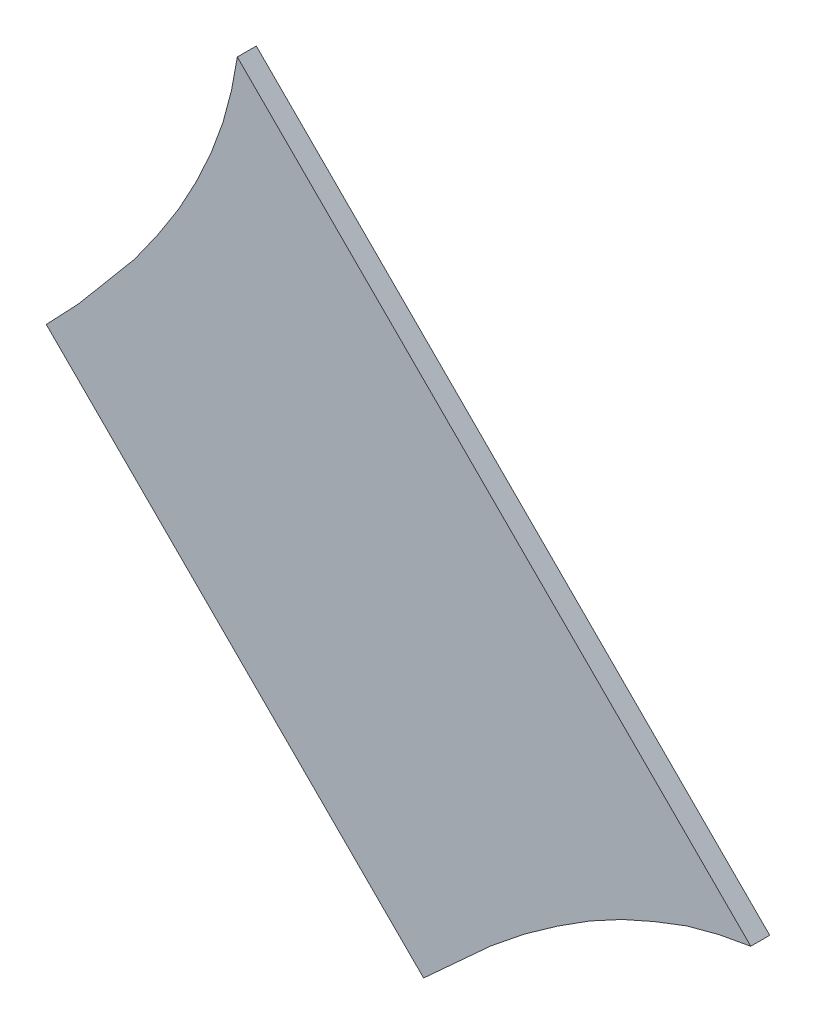
ISO-10303-21;
HEADER;
FILE_DESCRIPTION(('STEP AP214'),'2;1');
FILE_NAME('part.step','',(''),(''),'','','');
FILE_SCHEMA(('AUTOMOTIVE_DESIGN { 1 0 10303 214 1 1 1 1 }'));
ENDSEC;
DATA;
#1=APPLICATION_CONTEXT('core data for automotive mechanical design processes');
#2=APPLICATION_PROTOCOL_DEFINITION('international standard','automotive_design',2000,#1);
#3=PRODUCT_CONTEXT('',#1,'mechanical');
#4=PRODUCT('Part','Part','',(#3));
#5=PRODUCT_RELATED_PRODUCT_CATEGORY('part','',(#4));
#6=PRODUCT_DEFINITION_FORMATION('','',#4);
#7=PRODUCT_DEFINITION_CONTEXT('part definition',#1,'design');
#8=PRODUCT_DEFINITION('design','',#6,#7);
#9=PRODUCT_DEFINITION_SHAPE('','',#8);
#10=(LENGTH_UNIT() NAMED_UNIT(*) SI_UNIT(.MILLI.,.METRE.));
#11=(NAMED_UNIT(*) PLANE_ANGLE_UNIT() SI_UNIT($,.RADIAN.));
#12=(NAMED_UNIT(*) SI_UNIT($,.STERADIAN.) SOLID_ANGLE_UNIT());
#13=UNCERTAINTY_MEASURE_WITH_UNIT(LENGTH_MEASURE(1.E-05),#10,'distance_accuracy_value','');
#14=(GEOMETRIC_REPRESENTATION_CONTEXT(3) GLOBAL_UNCERTAINTY_ASSIGNED_CONTEXT((#13)) GLOBAL_UNIT_ASSIGNED_CONTEXT((#10,
#11,#12)) REPRESENTATION_CONTEXT('',''));
#15=CARTESIAN_POINT('',(0.,0.,0.));
#16=DIRECTION('',(0.,0.,1.));
#17=DIRECTION('',(1.,0.,0.));
#18=AXIS2_PLACEMENT_3D('',#15,#16,#17);
#19=CARTESIAN_POINT('',(77.5970001220703,103.069999694824,0.));
#20=DIRECTION('',(-0.674125127730621,0.73861716210915,0.));
#21=DIRECTION('',(0.73861716210915,0.674125127730621,0.));
#22=AXIS2_PLACEMENT_3D('',#19,#20,#21);
#23=PLANE('',#22);
#24=DIRECTION('',(0.73861716210915,0.674125127730621,0.));
#25=VECTOR('',#24,1.);
#26=CARTESIAN_POINT('',(77.5970001220703,103.069999694824,0.03556));
#27=LINE('',#26,#25);
#28=CARTESIAN_POINT('',(77.5970001220703,103.069999694824,0.03556));
#29=VERTEX_POINT('',#28);
#30=CARTESIAN_POINT('',(77.7229995727539,103.184997558594,0.03556));
#31=VERTEX_POINT('',#30);
#32=EDGE_CURVE('E11',#29,#31,#27,.T.);
#33=ORIENTED_EDGE('',*,*,#32,.F.);
#34=DIRECTION('',(0.,0.,1.));
#35=VECTOR('',#34,1.);
#36=CARTESIAN_POINT('',(77.5970001220703,103.069999694824,0.));
#37=LINE('',#36,#35);
#38=CARTESIAN_POINT('',(77.5970001220703,103.069999694824,0.));
#39=VERTEX_POINT('',#38);
#40=EDGE_CURVE('E24',#39,#29,#37,.T.);
#41=ORIENTED_EDGE('',*,*,#40,.F.);
#42=DIRECTION('',(0.73861716210915,0.674125127730621,0.));
#43=VECTOR('',#42,1.);
#44=CARTESIAN_POINT('',(77.5970001220703,103.069999694824,0.));
#45=LINE('',#44,#43);
#46=CARTESIAN_POINT('',(77.7229995727539,103.184997558594,0.));
#47=VERTEX_POINT('',#46);
#48=EDGE_CURVE('E172',#39,#47,#45,.T.);
#49=ORIENTED_EDGE('',*,*,#48,.T.);
#50=DIRECTION('',(0.,0.,1.));
#51=VECTOR('',#50,1.);
#52=CARTESIAN_POINT('',(77.7229995727539,103.184997558594,0.));
#53=LINE('',#52,#51);
#54=EDGE_CURVE('E37',#47,#31,#53,.T.);
#55=ORIENTED_EDGE('',*,*,#54,.T.);
#56=EDGE_LOOP('',(#33,#41,#49,#55));
#57=FACE_BOUND('',#56,.T.);
#58=ADVANCED_FACE('F17',(#57),#23,.F.);
#59=CARTESIAN_POINT('',(77.7229995727539,103.184997558594,0.));
#60=DIRECTION('',(-0.627750579044202,0.778414549266437,0.));
#61=DIRECTION('',(0.778414549266437,0.627750579044202,0.));
#62=AXIS2_PLACEMENT_3D('',#59,#60,#61);
#63=PLANE('',#62);
#64=DIRECTION('',(0.778414549266437,0.627750579044202,0.));
#65=VECTOR('',#64,1.);
#66=CARTESIAN_POINT('',(77.7229995727539,103.184997558594,0.03556));
#67=LINE('',#66,#65);
#68=CARTESIAN_POINT('',(77.7850036621094,103.235000610352,0.03556));
#69=VERTEX_POINT('',#68);
#70=EDGE_CURVE('E308',#31,#69,#67,.T.);
#71=ORIENTED_EDGE('',*,*,#70,.F.);
#72=ORIENTED_EDGE('',*,*,#54,.F.);
#73=DIRECTION('',(0.778414549266437,0.627750579044202,0.));
#74=VECTOR('',#73,1.);
#75=CARTESIAN_POINT('',(77.7229995727539,103.184997558594,0.));
#76=LINE('',#75,#74);
#77=CARTESIAN_POINT('',(77.7850036621094,103.235000610352,0.));
#78=VERTEX_POINT('',#77);
#79=EDGE_CURVE('E305',#47,#78,#76,.T.);
#80=ORIENTED_EDGE('',*,*,#79,.T.);
#81=DIRECTION('',(0.,0.,1.));
#82=VECTOR('',#81,1.);
#83=CARTESIAN_POINT('',(77.7850036621094,103.235000610352,0.));
#84=LINE('',#83,#82);
#85=EDGE_CURVE('E303',#78,#69,#84,.T.);
#86=ORIENTED_EDGE('',*,*,#85,.T.);
#87=EDGE_LOOP('',(#71,#72,#80,#86));
#88=FACE_BOUND('',#87,.T.);
#89=ADVANCED_FACE('F316',(#88),#63,.F.);
#90=CARTESIAN_POINT('',(77.7850036621094,103.235000610352,0.));
#91=DIRECTION('',(-0.578757770808919,0.815499505044786,0.));
#92=DIRECTION('',(0.815499505044786,0.578757770808919,0.));
#93=AXIS2_PLACEMENT_3D('',#90,#91,#92);
#94=PLANE('',#93);
#95=DIRECTION('',(0.815499505044786,0.578757770808919,0.));
#96=VECTOR('',#95,1.);
#97=CARTESIAN_POINT('',(77.7850036621094,103.235000610352,0.03556));
#98=LINE('',#97,#96);
#99=CARTESIAN_POINT('',(77.8470001220703,103.278999328613,0.03556));
#100=VERTEX_POINT('',#99);
#101=EDGE_CURVE('E300',#69,#100,#98,.T.);
#102=ORIENTED_EDGE('',*,*,#101,.F.);
#103=ORIENTED_EDGE('',*,*,#85,.F.);
#104=DIRECTION('',(0.815499505044786,0.578757770808919,0.));
#105=VECTOR('',#104,1.);
#106=CARTESIAN_POINT('',(77.7850036621094,103.235000610352,0.));
#107=LINE('',#106,#105);
#108=CARTESIAN_POINT('',(77.8470001220703,103.278999328613,0.));
#109=VERTEX_POINT('',#108);
#110=EDGE_CURVE('E297',#78,#109,#107,.T.);
#111=ORIENTED_EDGE('',*,*,#110,.T.);
#112=DIRECTION('',(0.,0.,1.));
#113=VECTOR('',#112,1.);
#114=CARTESIAN_POINT('',(77.8470001220703,103.278999328613,0.));
#115=LINE('',#114,#113);
#116=EDGE_CURVE('E295',#109,#100,#115,.T.);
#117=ORIENTED_EDGE('',*,*,#116,.T.);
#118=EDGE_LOOP('',(#102,#103,#111,#117));
#119=FACE_BOUND('',#118,.T.);
#120=ADVANCED_FACE('F322',(#119),#94,.F.);
#121=CARTESIAN_POINT('',(77.8470001220703,103.278999328613,0.));
#122=DIRECTION('',(-0.538694810440099,0.842500979942995,0.));
#123=DIRECTION('',(0.842500979942995,0.538694810440099,0.));
#124=AXIS2_PLACEMENT_3D('',#121,#122,#123);
#125=PLANE('',#124);
#126=DIRECTION('',(0.842500979942995,0.538694810440099,0.));
#127=VECTOR('',#126,1.);
#128=CARTESIAN_POINT('',(77.8470001220703,103.278999328613,0.03556));
#129=LINE('',#128,#127);
#130=CARTESIAN_POINT('',(77.9079971313477,103.318000793457,0.03556));
#131=VERTEX_POINT('',#130);
#132=EDGE_CURVE('E292',#100,#131,#129,.T.);
#133=ORIENTED_EDGE('',*,*,#132,.F.);
#134=ORIENTED_EDGE('',*,*,#116,.F.);
#135=DIRECTION('',(0.842500979942995,0.538694810440099,0.));
#136=VECTOR('',#135,1.);
#137=CARTESIAN_POINT('',(77.8470001220703,103.278999328613,0.));
#138=LINE('',#137,#136);
#139=CARTESIAN_POINT('',(77.9079971313477,103.318000793457,0.));
#140=VERTEX_POINT('',#139);
#141=EDGE_CURVE('E289',#109,#140,#138,.T.);
#142=ORIENTED_EDGE('',*,*,#141,.T.);
#143=DIRECTION('',(0.,0.,1.));
#144=VECTOR('',#143,1.);
#145=CARTESIAN_POINT('',(77.9079971313477,103.318000793457,0.));
#146=LINE('',#145,#144);
#147=EDGE_CURVE('E287',#140,#131,#146,.T.);
#148=ORIENTED_EDGE('',*,*,#147,.T.);
#149=EDGE_LOOP('',(#133,#134,#142,#148));
#150=FACE_BOUND('',#149,.T.);
#151=ADVANCED_FACE('F324',(#150),#125,.F.);
#152=CARTESIAN_POINT('',(77.9079971313477,103.318000793457,0.));
#153=DIRECTION('',(-0.475758597963286,0.879575895795245,0.));
#154=DIRECTION('',(0.879575895795245,0.475758597963286,0.));
#155=AXIS2_PLACEMENT_3D('',#152,#153,#154);
#156=PLANE('',#155);
#157=DIRECTION('',(0.879575895795245,0.475758597963286,0.));
#158=VECTOR('',#157,1.);
#159=CARTESIAN_POINT('',(77.9079971313477,103.318000793457,0.03556));
#160=LINE('',#159,#158);
#161=CARTESIAN_POINT('',(77.9690017700195,103.350997924805,0.03556));
#162=VERTEX_POINT('',#161);
#163=EDGE_CURVE('E284',#131,#162,#160,.T.);
#164=ORIENTED_EDGE('',*,*,#163,.F.);
#165=ORIENTED_EDGE('',*,*,#147,.F.);
#166=DIRECTION('',(0.879575895795245,0.475758597963286,0.));
#167=VECTOR('',#166,1.);
#168=CARTESIAN_POINT('',(77.9079971313477,103.318000793457,0.));
#169=LINE('',#168,#167);
#170=CARTESIAN_POINT('',(77.9690017700195,103.350997924805,0.));
#171=VERTEX_POINT('',#170);
#172=EDGE_CURVE('E281',#140,#171,#169,.T.);
#173=ORIENTED_EDGE('',*,*,#172,.T.);
#174=DIRECTION('',(0.,0.,1.));
#175=VECTOR('',#174,1.);
#176=CARTESIAN_POINT('',(77.9690017700195,103.350997924805,0.));
#177=LINE('',#176,#175);
#178=EDGE_CURVE('E279',#171,#162,#177,.T.);
#179=ORIENTED_EDGE('',*,*,#178,.T.);
#180=EDGE_LOOP('',(#164,#165,#173,#179));
#181=FACE_BOUND('',#180,.T.);
#182=ADVANCED_FACE('F329',(#181),#156,.F.);
#183=CARTESIAN_POINT('',(77.9690017700195,103.350997924805,0.));
#184=DIRECTION('',(-0.404769061439909,0.914418944959615,0.));
#185=DIRECTION('',(0.914418944959615,0.404769061439909,0.));
#186=AXIS2_PLACEMENT_3D('',#183,#184,#185);
#187=PLANE('',#186);
#188=DIRECTION('',(0.914418944959615,0.404769061439909,0.));
#189=VECTOR('',#188,1.);
#190=CARTESIAN_POINT('',(77.9690017700195,103.350997924805,0.03556));
#191=LINE('',#190,#189);
#192=CARTESIAN_POINT('',(78.0299987792969,103.377998352051,0.03556));
#193=VERTEX_POINT('',#192);
#194=EDGE_CURVE('E276',#162,#193,#191,.T.);
#195=ORIENTED_EDGE('',*,*,#194,.F.);
#196=ORIENTED_EDGE('',*,*,#178,.F.);
#197=DIRECTION('',(0.914418944959615,0.404769061439909,0.));
#198=VECTOR('',#197,1.);
#199=CARTESIAN_POINT('',(77.9690017700195,103.350997924805,0.));
#200=LINE('',#199,#198);
#201=CARTESIAN_POINT('',(78.0299987792969,103.377998352051,0.));
#202=VERTEX_POINT('',#201);
#203=EDGE_CURVE('E273',#171,#202,#200,.T.);
#204=ORIENTED_EDGE('',*,*,#203,.T.);
#205=DIRECTION('',(0.,0.,1.));
#206=VECTOR('',#205,1.);
#207=CARTESIAN_POINT('',(78.0299987792969,103.377998352051,0.));
#208=LINE('',#207,#206);
#209=EDGE_CURVE('E271',#202,#193,#208,.T.);
#210=ORIENTED_EDGE('',*,*,#209,.T.);
#211=EDGE_LOOP('',(#195,#196,#204,#210));
#212=FACE_BOUND('',#211,.T.);
#213=ADVANCED_FACE('F332',(#212),#187,.F.);
#214=CARTESIAN_POINT('',(78.0299987792969,103.377998352051,0.));
#215=DIRECTION('',(-0.357984321604058,0.933727597046206,0.));
#216=DIRECTION('',(0.933727597046206,0.357984321604058,0.));
#217=AXIS2_PLACEMENT_3D('',#214,#215,#216);
#218=PLANE('',#217);
#219=DIRECTION('',(0.933727597046206,0.357984321604058,0.));
#220=VECTOR('',#219,1.);
#221=CARTESIAN_POINT('',(78.0299987792969,103.377998352051,0.03556));
#222=LINE('',#221,#220);
#223=CARTESIAN_POINT('',(78.0899963378906,103.401000976562,0.03556));
#224=VERTEX_POINT('',#223);
#225=EDGE_CURVE('E268',#193,#224,#222,.T.);
#226=ORIENTED_EDGE('',*,*,#225,.F.);
#227=ORIENTED_EDGE('',*,*,#209,.F.);
#228=DIRECTION('',(0.933727597046206,0.357984321604058,0.));
#229=VECTOR('',#228,1.);
#230=CARTESIAN_POINT('',(78.0299987792969,103.377998352051,0.));
#231=LINE('',#230,#229);
#232=CARTESIAN_POINT('',(78.0899963378906,103.401000976562,0.));
#233=VERTEX_POINT('',#232);
#234=EDGE_CURVE('E265',#202,#233,#231,.T.);
#235=ORIENTED_EDGE('',*,*,#234,.T.);
#236=DIRECTION('',(0.,0.,1.));
#237=VECTOR('',#236,1.);
#238=CARTESIAN_POINT('',(78.0899963378906,103.401000976562,0.));
#239=LINE('',#238,#237);
#240=EDGE_CURVE('E263',#233,#224,#239,.T.);
#241=ORIENTED_EDGE('',*,*,#240,.T.);
#242=EDGE_LOOP('',(#226,#227,#235,#241));
#243=FACE_BOUND('',#242,.T.);
#244=ADVANCED_FACE('F337',(#243),#218,.F.);
#245=CARTESIAN_POINT('',(78.0899963378906,103.401000976562,0.));
#246=DIRECTION('',(-0.257624417848363,0.966245134180914,0.));
#247=DIRECTION('',(0.966245134180914,0.257624417848363,0.));
#248=AXIS2_PLACEMENT_3D('',#245,#246,#247);
#249=PLANE('',#248);
#250=DIRECTION('',(0.966245134180914,0.257624417848363,0.));
#251=VECTOR('',#250,1.);
#252=CARTESIAN_POINT('',(78.0899963378906,103.401000976562,0.03556));
#253=LINE('',#252,#251);
#254=CARTESIAN_POINT('',(78.1500015258789,103.416999816895,0.03556));
#255=VERTEX_POINT('',#254);
#256=EDGE_CURVE('E260',#224,#255,#253,.T.);
#257=ORIENTED_EDGE('',*,*,#256,.F.);
#258=ORIENTED_EDGE('',*,*,#240,.F.);
#259=DIRECTION('',(0.966245134180914,0.257624417848363,0.));
#260=VECTOR('',#259,1.);
#261=CARTESIAN_POINT('',(78.0899963378906,103.401000976562,0.));
#262=LINE('',#261,#260);
#263=CARTESIAN_POINT('',(78.1500015258789,103.416999816895,0.));
#264=VERTEX_POINT('',#263);
#265=EDGE_CURVE('E257',#233,#264,#262,.T.);
#266=ORIENTED_EDGE('',*,*,#265,.T.);
#267=DIRECTION('',(0.,0.,1.));
#268=VECTOR('',#267,1.);
#269=CARTESIAN_POINT('',(78.1500015258789,103.416999816895,0.));
#270=LINE('',#269,#268);
#271=EDGE_CURVE('E255',#264,#255,#270,.T.);
#272=ORIENTED_EDGE('',*,*,#271,.T.);
#273=EDGE_LOOP('',(#257,#258,#266,#272));
#274=FACE_BOUND('',#273,.T.);
#275=ADVANCED_FACE('F340',(#274),#249,.F.);
#276=CARTESIAN_POINT('',(78.1500015258789,103.416999816895,0.));
#277=DIRECTION('',(-0.180360137856034,0.983600640845944,0.));
#278=DIRECTION('',(0.983600640845944,0.180360137856034,0.));
#279=AXIS2_PLACEMENT_3D('',#276,#277,#278);
#280=PLANE('',#279);
#281=DIRECTION('',(0.983600640845944,0.180360137856034,0.));
#282=VECTOR('',#281,1.);
#283=CARTESIAN_POINT('',(78.1500015258789,103.416999816895,0.03556));
#284=LINE('',#283,#282);
#285=CARTESIAN_POINT('',(78.2099990844727,103.428001403809,0.03556));
#286=VERTEX_POINT('',#285);
#287=EDGE_CURVE('E252',#255,#286,#284,.T.);
#288=ORIENTED_EDGE('',*,*,#287,.F.);
#289=ORIENTED_EDGE('',*,*,#271,.F.);
#290=DIRECTION('',(0.983600640845944,0.180360137856034,0.));
#291=VECTOR('',#290,1.);
#292=CARTESIAN_POINT('',(78.1500015258789,103.416999816895,0.));
#293=LINE('',#292,#291);
#294=CARTESIAN_POINT('',(78.2099990844727,103.428001403809,0.));
#295=VERTEX_POINT('',#294);
#296=EDGE_CURVE('E249',#264,#295,#293,.T.);
#297=ORIENTED_EDGE('',*,*,#296,.T.);
#298=DIRECTION('',(0.,0.,1.));
#299=VECTOR('',#298,1.);
#300=CARTESIAN_POINT('',(78.2099990844727,103.428001403809,0.));
#301=LINE('',#300,#299);
#302=EDGE_CURVE('E247',#295,#286,#301,.T.);
#303=ORIENTED_EDGE('',*,*,#302,.T.);
#304=EDGE_LOOP('',(#288,#289,#297,#303));
#305=FACE_BOUND('',#304,.T.);
#306=ADVANCED_FACE('F345',(#305),#280,.F.);
#307=CARTESIAN_POINT('',(78.2099990844727,103.428001403809,0.));
#308=DIRECTION('',(-0.707106781186548,-0.707106781186548,0.));
#309=DIRECTION('',(-0.707106781186548,0.707106781186548,0.));
#310=AXIS2_PLACEMENT_3D('',#307,#308,#309);
#311=PLANE('',#310);
#312=DIRECTION('',(-0.707106781186548,0.707106781186548,0.));
#313=VECTOR('',#312,1.);
#314=CARTESIAN_POINT('',(78.2099990844727,103.428001403809,0.03556));
#315=LINE('',#314,#313);
#316=CARTESIAN_POINT('',(77.2480010986328,104.389999389648,0.03556));
#317=VERTEX_POINT('',#316);
#318=EDGE_CURVE('E244',#286,#317,#315,.T.);
#319=ORIENTED_EDGE('',*,*,#318,.F.);
#320=ORIENTED_EDGE('',*,*,#302,.F.);
#321=DIRECTION('',(-0.707106781186548,0.707106781186548,0.));
#322=VECTOR('',#321,1.);
#323=CARTESIAN_POINT('',(78.2099990844727,103.428001403809,0.));
#324=LINE('',#323,#322);
#325=CARTESIAN_POINT('',(77.2480010986328,104.389999389648,0.));
#326=VERTEX_POINT('',#325);
#327=EDGE_CURVE('E241',#295,#326,#324,.T.);
#328=ORIENTED_EDGE('',*,*,#327,.T.);
#329=DIRECTION('',(0.,0.,1.));
#330=VECTOR('',#329,1.);
#331=CARTESIAN_POINT('',(77.2480010986328,104.389999389648,0.));
#332=LINE('',#331,#330);
#333=EDGE_CURVE('E239',#326,#317,#332,.T.);
#334=ORIENTED_EDGE('',*,*,#333,.T.);
#335=EDGE_LOOP('',(#319,#320,#328,#334));
#336=FACE_BOUND('',#335,.T.);
#337=ADVANCED_FACE('F348',(#336),#311,.F.);
#338=CARTESIAN_POINT('',(77.2480010986328,104.389999389648,0.));
#339=DIRECTION('',(0.983600640845944,-0.180360137856034,0.));
#340=DIRECTION('',(-0.180360137856034,-0.983600640845944,0.));
#341=AXIS2_PLACEMENT_3D('',#338,#339,#340);
#342=PLANE('',#341);
#343=DIRECTION('',(-0.180360137856034,-0.983600640845944,0.));
#344=VECTOR('',#343,1.);
#345=CARTESIAN_POINT('',(77.2480010986328,104.389999389648,0.03556));
#346=LINE('',#345,#344);
#347=CARTESIAN_POINT('',(77.2369995117188,104.330001831055,0.03556));
#348=VERTEX_POINT('',#347);
#349=EDGE_CURVE('E236',#317,#348,#346,.T.);
#350=ORIENTED_EDGE('',*,*,#349,.F.);
#351=ORIENTED_EDGE('',*,*,#333,.F.);
#352=DIRECTION('',(-0.180360137856034,-0.983600640845944,0.));
#353=VECTOR('',#352,1.);
#354=CARTESIAN_POINT('',(77.2480010986328,104.389999389648,0.));
#355=LINE('',#354,#353);
#356=CARTESIAN_POINT('',(77.2369995117188,104.330001831055,0.));
#357=VERTEX_POINT('',#356);
#358=EDGE_CURVE('E233',#326,#357,#355,.T.);
#359=ORIENTED_EDGE('',*,*,#358,.T.);
#360=DIRECTION('',(0.,0.,1.));
#361=VECTOR('',#360,1.);
#362=CARTESIAN_POINT('',(77.2369995117188,104.330001831055,0.));
#363=LINE('',#362,#361);
#364=EDGE_CURVE('E231',#357,#348,#363,.T.);
#365=ORIENTED_EDGE('',*,*,#364,.T.);
#366=EDGE_LOOP('',(#350,#351,#359,#365));
#367=FACE_BOUND('',#366,.T.);
#368=ADVANCED_FACE('F353',(#367),#342,.F.);
#369=CARTESIAN_POINT('',(77.2369995117188,104.330001831055,0.));
#370=DIRECTION('',(0.966245134180914,-0.257624417848363,0.));
#371=DIRECTION('',(-0.257624417848363,-0.966245134180914,0.));
#372=AXIS2_PLACEMENT_3D('',#369,#370,#371);
#373=PLANE('',#372);
#374=DIRECTION('',(-0.257624417848363,-0.966245134180914,0.));
#375=VECTOR('',#374,1.);
#376=CARTESIAN_POINT('',(77.2369995117188,104.330001831055,0.03556));
#377=LINE('',#376,#375);
#378=CARTESIAN_POINT('',(77.2210006713867,104.269996643066,0.03556));
#379=VERTEX_POINT('',#378);
#380=EDGE_CURVE('E228',#348,#379,#377,.T.);
#381=ORIENTED_EDGE('',*,*,#380,.F.);
#382=ORIENTED_EDGE('',*,*,#364,.F.);
#383=DIRECTION('',(-0.257624417848363,-0.966245134180914,0.));
#384=VECTOR('',#383,1.);
#385=CARTESIAN_POINT('',(77.2369995117188,104.330001831055,0.));
#386=LINE('',#385,#384);
#387=CARTESIAN_POINT('',(77.2210006713867,104.269996643066,0.));
#388=VERTEX_POINT('',#387);
#389=EDGE_CURVE('E225',#357,#388,#386,.T.);
#390=ORIENTED_EDGE('',*,*,#389,.T.);
#391=DIRECTION('',(0.,0.,1.));
#392=VECTOR('',#391,1.);
#393=CARTESIAN_POINT('',(77.2210006713867,104.269996643066,0.));
#394=LINE('',#393,#392);
#395=EDGE_CURVE('E223',#388,#379,#394,.T.);
#396=ORIENTED_EDGE('',*,*,#395,.T.);
#397=EDGE_LOOP('',(#381,#382,#390,#396));
#398=FACE_BOUND('',#397,.T.);
#399=ADVANCED_FACE('F356',(#398),#373,.F.);
#400=CARTESIAN_POINT('',(77.2210006713867,104.269996643066,0.));
#401=DIRECTION('',(0.938855734355202,-0.344310775417142,0.));
#402=DIRECTION('',(-0.344310775417142,-0.938855734355202,0.));
#403=AXIS2_PLACEMENT_3D('',#400,#401,#402);
#404=PLANE('',#403);
#405=DIRECTION('',(-0.344310775417142,-0.938855734355202,0.));
#406=VECTOR('',#405,1.);
#407=CARTESIAN_POINT('',(77.2210006713867,104.269996643066,0.03556));
#408=LINE('',#407,#406);
#409=CARTESIAN_POINT('',(77.1989974975586,104.209999084473,0.03556));
#410=VERTEX_POINT('',#409);
#411=EDGE_CURVE('E220',#379,#410,#408,.T.);
#412=ORIENTED_EDGE('',*,*,#411,.F.);
#413=ORIENTED_EDGE('',*,*,#395,.F.);
#414=DIRECTION('',(-0.344310775417142,-0.938855734355202,0.));
#415=VECTOR('',#414,1.);
#416=CARTESIAN_POINT('',(77.2210006713867,104.269996643066,0.));
#417=LINE('',#416,#415);
#418=CARTESIAN_POINT('',(77.1989974975586,104.209999084473,0.));
#419=VERTEX_POINT('',#418);
#420=EDGE_CURVE('E217',#388,#419,#417,.T.);
#421=ORIENTED_EDGE('',*,*,#420,.T.);
#422=DIRECTION('',(0.,0.,1.));
#423=VECTOR('',#422,1.);
#424=CARTESIAN_POINT('',(77.1989974975586,104.209999084473,0.));
#425=LINE('',#424,#423);
#426=EDGE_CURVE('E215',#419,#410,#425,.T.);
#427=ORIENTED_EDGE('',*,*,#426,.T.);
#428=EDGE_LOOP('',(#412,#413,#421,#427));
#429=FACE_BOUND('',#428,.T.);
#430=ADVANCED_FACE('F361',(#429),#404,.F.);
#431=CARTESIAN_POINT('',(77.1989974975586,104.209999084473,0.));
#432=DIRECTION('',(0.908822480400275,-0.417183052291308,0.));
#433=DIRECTION('',(-0.417183052291308,-0.908822480400275,0.));
#434=AXIS2_PLACEMENT_3D('',#431,#432,#433);
#435=PLANE('',#434);
#436=DIRECTION('',(-0.417183052291308,-0.908822480400275,0.));
#437=VECTOR('',#436,1.);
#438=CARTESIAN_POINT('',(77.1989974975586,104.209999084473,0.03556));
#439=LINE('',#438,#437);
#440=CARTESIAN_POINT('',(77.1709976196289,104.149002075195,0.03556));
#441=VERTEX_POINT('',#440);
#442=EDGE_CURVE('E212',#410,#441,#439,.T.);
#443=ORIENTED_EDGE('',*,*,#442,.F.);
#444=ORIENTED_EDGE('',*,*,#426,.F.);
#445=DIRECTION('',(-0.417183052291308,-0.908822480400275,0.));
#446=VECTOR('',#445,1.);
#447=CARTESIAN_POINT('',(77.1989974975586,104.209999084473,0.));
#448=LINE('',#447,#446);
#449=CARTESIAN_POINT('',(77.1709976196289,104.149002075195,0.));
#450=VERTEX_POINT('',#449);
#451=EDGE_CURVE('E209',#419,#450,#448,.T.);
#452=ORIENTED_EDGE('',*,*,#451,.T.);
#453=DIRECTION('',(0.,0.,1.));
#454=VECTOR('',#453,1.);
#455=CARTESIAN_POINT('',(77.1709976196289,104.149002075195,0.));
#456=LINE('',#455,#454);
#457=EDGE_CURVE('E207',#450,#441,#456,.T.);
#458=ORIENTED_EDGE('',*,*,#457,.T.);
#459=EDGE_LOOP('',(#443,#444,#452,#458));
#460=FACE_BOUND('',#459,.T.);
#461=ADVANCED_FACE('F364',(#460),#435,.F.);
#462=CARTESIAN_POINT('',(77.1709976196289,104.149002075195,0.));
#463=DIRECTION('',(0.879575895795245,-0.475758597963286,0.));
#464=DIRECTION('',(-0.475758597963286,-0.879575895795245,0.));
#465=AXIS2_PLACEMENT_3D('',#462,#463,#464);
#466=PLANE('',#465);
#467=DIRECTION('',(-0.475758597963286,-0.879575895795245,0.));
#468=VECTOR('',#467,1.);
#469=CARTESIAN_POINT('',(77.1709976196289,104.149002075195,0.03556));
#470=LINE('',#469,#468);
#471=CARTESIAN_POINT('',(77.1380004882812,104.087997436523,0.03556));
#472=VERTEX_POINT('',#471);
#473=EDGE_CURVE('E204',#441,#472,#470,.T.);
#474=ORIENTED_EDGE('',*,*,#473,.F.);
#475=ORIENTED_EDGE('',*,*,#457,.F.);
#476=DIRECTION('',(-0.475758597963286,-0.879575895795245,0.));
#477=VECTOR('',#476,1.);
#478=CARTESIAN_POINT('',(77.1709976196289,104.149002075195,0.));
#479=LINE('',#478,#477);
#480=CARTESIAN_POINT('',(77.1380004882812,104.087997436523,0.));
#481=VERTEX_POINT('',#480);
#482=EDGE_CURVE('E201',#450,#481,#479,.T.);
#483=ORIENTED_EDGE('',*,*,#482,.T.);
#484=DIRECTION('',(0.,0.,1.));
#485=VECTOR('',#484,1.);
#486=CARTESIAN_POINT('',(77.1380004882812,104.087997436523,0.));
#487=LINE('',#486,#485);
#488=EDGE_CURVE('E199',#481,#472,#487,.T.);
#489=ORIENTED_EDGE('',*,*,#488,.T.);
#490=EDGE_LOOP('',(#474,#475,#483,#489));
#491=FACE_BOUND('',#490,.T.);
#492=ADVANCED_FACE('F369',(#491),#466,.F.);
#493=CARTESIAN_POINT('',(77.1380004882812,104.087997436523,0.));
#494=DIRECTION('',(0.842500979942995,-0.538694810440099,0.));
#495=DIRECTION('',(-0.538694810440099,-0.842500979942995,0.));
#496=AXIS2_PLACEMENT_3D('',#493,#494,#495);
#497=PLANE('',#496);
#498=DIRECTION('',(-0.538694810440099,-0.842500979942995,0.));
#499=VECTOR('',#498,1.);
#500=CARTESIAN_POINT('',(77.1380004882812,104.087997436523,0.03556));
#501=LINE('',#500,#499);
#502=CARTESIAN_POINT('',(77.0989990234375,104.027000427246,0.03556));
#503=VERTEX_POINT('',#502);
#504=EDGE_CURVE('E196',#472,#503,#501,.T.);
#505=ORIENTED_EDGE('',*,*,#504,.F.);
#506=ORIENTED_EDGE('',*,*,#488,.F.);
#507=DIRECTION('',(-0.538694810440099,-0.842500979942995,0.));
#508=VECTOR('',#507,1.);
#509=CARTESIAN_POINT('',(77.1380004882812,104.087997436523,0.));
#510=LINE('',#509,#508);
#511=CARTESIAN_POINT('',(77.0989990234375,104.027000427246,0.));
#512=VERTEX_POINT('',#511);
#513=EDGE_CURVE('E193',#481,#512,#510,.T.);
#514=ORIENTED_EDGE('',*,*,#513,.T.);
#515=DIRECTION('',(0.,0.,1.));
#516=VECTOR('',#515,1.);
#517=CARTESIAN_POINT('',(77.0989990234375,104.027000427246,0.));
#518=LINE('',#517,#516);
#519=EDGE_CURVE('E191',#512,#503,#518,.T.);
#520=ORIENTED_EDGE('',*,*,#519,.T.);
#521=EDGE_LOOP('',(#505,#506,#514,#520));
#522=FACE_BOUND('',#521,.T.);
#523=ADVANCED_FACE('F372',(#522),#497,.F.);
#524=CARTESIAN_POINT('',(77.0989990234375,104.027000427246,0.));
#525=DIRECTION('',(0.815533116494249,-0.578710407631639,0.));
#526=DIRECTION('',(-0.578710407631639,-0.815533116494249,0.));
#527=AXIS2_PLACEMENT_3D('',#524,#525,#526);
#528=PLANE('',#527);
#529=DIRECTION('',(-0.578710407631639,-0.815533116494249,0.));
#530=VECTOR('',#529,1.);
#531=CARTESIAN_POINT('',(77.0989990234375,104.027000427246,0.03556));
#532=LINE('',#531,#530);
#533=CARTESIAN_POINT('',(77.0550003051758,103.964996337891,0.03556));
#534=VERTEX_POINT('',#533);
#535=EDGE_CURVE('E188',#503,#534,#532,.T.);
#536=ORIENTED_EDGE('',*,*,#535,.F.);
#537=ORIENTED_EDGE('',*,*,#519,.F.);
#538=DIRECTION('',(-0.578710407631639,-0.815533116494249,0.));
#539=VECTOR('',#538,1.);
#540=CARTESIAN_POINT('',(77.0989990234375,104.027000427246,0.));
#541=LINE('',#540,#539);
#542=CARTESIAN_POINT('',(77.0550003051758,103.964996337891,0.));
#543=VERTEX_POINT('',#542);
#544=EDGE_CURVE('E185',#512,#543,#541,.T.);
#545=ORIENTED_EDGE('',*,*,#544,.T.);
#546=DIRECTION('',(0.,0.,1.));
#547=VECTOR('',#546,1.);
#548=CARTESIAN_POINT('',(77.0550003051758,103.964996337891,0.));
#549=LINE('',#548,#547);
#550=EDGE_CURVE('E183',#543,#534,#549,.T.);
#551=ORIENTED_EDGE('',*,*,#550,.T.);
#552=EDGE_LOOP('',(#536,#537,#545,#551));
#553=FACE_BOUND('',#552,.T.);
#554=ADVANCED_FACE('F377',(#553),#528,.F.);
#555=CARTESIAN_POINT('',(77.0550003051758,103.964996337891,0.));
#556=DIRECTION('',(0.765694737468783,-0.643204142564872,0.));
#557=DIRECTION('',(-0.643204142564872,-0.765694737468783,0.));
#558=AXIS2_PLACEMENT_3D('',#555,#556,#557);
#559=PLANE('',#558);
#560=DIRECTION('',(-0.643204142564872,-0.765694737468783,0.));
#561=VECTOR('',#560,1.);
#562=CARTESIAN_POINT('',(77.0550003051758,103.964996337891,0.03556));
#563=LINE('',#562,#561);
#564=CARTESIAN_POINT('',(76.9499969482422,103.839996337891,0.03556));
#565=VERTEX_POINT('',#564);
#566=EDGE_CURVE('E180',#534,#565,#563,.T.);
#567=ORIENTED_EDGE('',*,*,#566,.F.);
#568=ORIENTED_EDGE('',*,*,#550,.F.);
#569=DIRECTION('',(-0.643204142564872,-0.765694737468783,0.));
#570=VECTOR('',#569,1.);
#571=CARTESIAN_POINT('',(77.0550003051758,103.964996337891,0.));
#572=LINE('',#571,#570);
#573=CARTESIAN_POINT('',(76.9499969482422,103.839996337891,0.));
#574=VERTEX_POINT('',#573);
#575=EDGE_CURVE('E178',#543,#574,#572,.T.);
#576=ORIENTED_EDGE('',*,*,#575,.T.);
#577=DIRECTION('',(0.,0.,1.));
#578=VECTOR('',#577,1.);
#579=CARTESIAN_POINT('',(76.9499969482422,103.839996337891,0.));
#580=LINE('',#579,#578);
#581=EDGE_CURVE('E163',#574,#565,#580,.T.);
#582=ORIENTED_EDGE('',*,*,#581,.T.);
#583=EDGE_LOOP('',(#567,#568,#576,#582));
#584=FACE_BOUND('',#583,.T.);
#585=ADVANCED_FACE('F379',(#584),#559,.F.);
#586=CARTESIAN_POINT('',(76.9499969482422,103.839996337891,0.));
#587=DIRECTION('',(0.724129588639311,-0.68966393182264,0.));
#588=DIRECTION('',(-0.68966393182264,-0.724129588639311,0.));
#589=AXIS2_PLACEMENT_3D('',#586,#587,#588);
#590=PLANE('',#589);
#591=DIRECTION('',(-0.68966393182264,-0.724129588639311,0.));
#592=VECTOR('',#591,1.);
#593=CARTESIAN_POINT('',(76.9499969482422,103.839996337891,0.03556));
#594=LINE('',#593,#592);
#595=CARTESIAN_POINT('',(76.8899993896484,103.777000427246,0.03556));
#596=VERTEX_POINT('',#595);
#597=EDGE_CURVE('E167',#565,#596,#594,.T.);
#598=ORIENTED_EDGE('',*,*,#597,.F.);
#599=ORIENTED_EDGE('',*,*,#581,.F.);
#600=DIRECTION('',(-0.68966393182264,-0.724129588639311,0.));
#601=VECTOR('',#600,1.);
#602=CARTESIAN_POINT('',(76.9499969482422,103.839996337891,0.));
#603=LINE('',#602,#601);
#604=CARTESIAN_POINT('',(76.8899993896484,103.777000427246,0.));
#605=VERTEX_POINT('',#604);
#606=EDGE_CURVE('E159',#574,#605,#603,.T.);
#607=ORIENTED_EDGE('',*,*,#606,.T.);
#608=DIRECTION('',(0.,0.,1.));
#609=VECTOR('',#608,1.);
#610=CARTESIAN_POINT('',(76.8899993896484,103.777000427246,0.));
#611=LINE('',#610,#609);
#612=EDGE_CURVE('E149',#605,#596,#611,.T.);
#613=ORIENTED_EDGE('',*,*,#612,.T.);
#614=EDGE_LOOP('',(#598,#599,#607,#613));
#615=FACE_BOUND('',#614,.T.);
#616=ADVANCED_FACE('F162',(#615),#590,.F.);
#617=CARTESIAN_POINT('',(76.8899993896484,103.777000427246,0.));
#618=DIRECTION('',(0.707106781186548,0.707106781186548,0.));
#619=DIRECTION('',(0.707106781186548,-0.707106781186548,0.));
#620=AXIS2_PLACEMENT_3D('',#617,#618,#619);
#621=PLANE('',#620);
#622=DIRECTION('',(0.707106781186548,-0.707106781186548,0.));
#623=VECTOR('',#622,1.);
#624=CARTESIAN_POINT('',(76.8899993896484,103.777000427246,0.03556));
#625=LINE('',#624,#623);
#626=EDGE_CURVE('E155',#596,#29,#625,.T.);
#627=ORIENTED_EDGE('',*,*,#626,.F.);
#628=ORIENTED_EDGE('',*,*,#612,.F.);
#629=DIRECTION('',(0.707106781186548,-0.707106781186548,0.));
#630=VECTOR('',#629,1.);
#631=CARTESIAN_POINT('',(76.8899993896484,103.777000427246,0.));
#632=LINE('',#631,#630);
#633=EDGE_CURVE('E153',#605,#39,#632,.T.);
#634=ORIENTED_EDGE('',*,*,#633,.T.);
#635=ORIENTED_EDGE('',*,*,#40,.T.);
#636=EDGE_LOOP('',(#627,#628,#634,#635));
#637=FACE_BOUND('',#636,.T.);
#638=ADVANCED_FACE('F151',(#637),#621,.F.);
#639=CARTESIAN_POINT('',(77.5970001220703,103.069999694824,0.));
#640=DIRECTION('',(0.,0.,1.));
#641=DIRECTION('',(1.,0.,0.));
#642=AXIS2_PLACEMENT_3D('',#639,#640,#641);
#643=PLANE('',#642);
#644=ORIENTED_EDGE('',*,*,#633,.F.);
#645=ORIENTED_EDGE('',*,*,#606,.F.);
#646=ORIENTED_EDGE('',*,*,#575,.F.);
#647=ORIENTED_EDGE('',*,*,#544,.F.);
#648=ORIENTED_EDGE('',*,*,#513,.F.);
#649=ORIENTED_EDGE('',*,*,#482,.F.);
#650=ORIENTED_EDGE('',*,*,#451,.F.);
#651=ORIENTED_EDGE('',*,*,#420,.F.);
#652=ORIENTED_EDGE('',*,*,#389,.F.);
#653=ORIENTED_EDGE('',*,*,#358,.F.);
#654=ORIENTED_EDGE('',*,*,#327,.F.);
#655=ORIENTED_EDGE('',*,*,#296,.F.);
#656=ORIENTED_EDGE('',*,*,#265,.F.);
#657=ORIENTED_EDGE('',*,*,#234,.F.);
#658=ORIENTED_EDGE('',*,*,#203,.F.);
#659=ORIENTED_EDGE('',*,*,#172,.F.);
#660=ORIENTED_EDGE('',*,*,#141,.F.);
#661=ORIENTED_EDGE('',*,*,#110,.F.);
#662=ORIENTED_EDGE('',*,*,#79,.F.);
#663=ORIENTED_EDGE('',*,*,#48,.F.);
#664=EDGE_LOOP('',(#644,#645,#646,#647,#648,#649,#650,#651,#652,#653,#654,#655,#656,#657,#658,
#659,#660,#661,#662,#663));
#665=FACE_BOUND('',#664,.T.);
#666=ADVANCED_FACE('F170',(#665),#643,.F.);
#667=CARTESIAN_POINT('',(77.5970001220703,103.069999694824,0.03556));
#668=DIRECTION('',(0.,0.,1.));
#669=DIRECTION('',(1.,0.,0.));
#670=AXIS2_PLACEMENT_3D('',#667,#668,#669);
#671=PLANE('',#670);
#672=ORIENTED_EDGE('',*,*,#32,.T.);
#673=ORIENTED_EDGE('',*,*,#70,.T.);
#674=ORIENTED_EDGE('',*,*,#101,.T.);
#675=ORIENTED_EDGE('',*,*,#132,.T.);
#676=ORIENTED_EDGE('',*,*,#163,.T.);
#677=ORIENTED_EDGE('',*,*,#194,.T.);
#678=ORIENTED_EDGE('',*,*,#225,.T.);
#679=ORIENTED_EDGE('',*,*,#256,.T.);
#680=ORIENTED_EDGE('',*,*,#287,.T.);
#681=ORIENTED_EDGE('',*,*,#318,.T.);
#682=ORIENTED_EDGE('',*,*,#349,.T.);
#683=ORIENTED_EDGE('',*,*,#380,.T.);
#684=ORIENTED_EDGE('',*,*,#411,.T.);
#685=ORIENTED_EDGE('',*,*,#442,.T.);
#686=ORIENTED_EDGE('',*,*,#473,.T.);
#687=ORIENTED_EDGE('',*,*,#504,.T.);
#688=ORIENTED_EDGE('',*,*,#535,.T.);
#689=ORIENTED_EDGE('',*,*,#566,.T.);
#690=ORIENTED_EDGE('',*,*,#597,.T.);
#691=ORIENTED_EDGE('',*,*,#626,.T.);
#692=EDGE_LOOP('',(#672,#673,#674,#675,#676,#677,#678,#679,#680,#681,#682,#683,#684,#685,#686,
#687,#688,#689,#690,#691));
#693=FACE_BOUND('',#692,.T.);
#694=ADVANCED_FACE('F319',(#693),#671,.T.);
#695=CLOSED_SHELL('',(#58,#89,#120,#151,#182,#213,#244,#275,#306,#337,#368,#399,#430,#461,#492,
#523,#554,#585,#616,#638,#666,#694));
#696=MANIFOLD_SOLID_BREP('B1',#695);
#697=ADVANCED_BREP_SHAPE_REPRESENTATION('',(#18,#696),#14);
#698=SHAPE_DEFINITION_REPRESENTATION(#9,#697);
ENDSEC;
END-ISO-10303-21;
